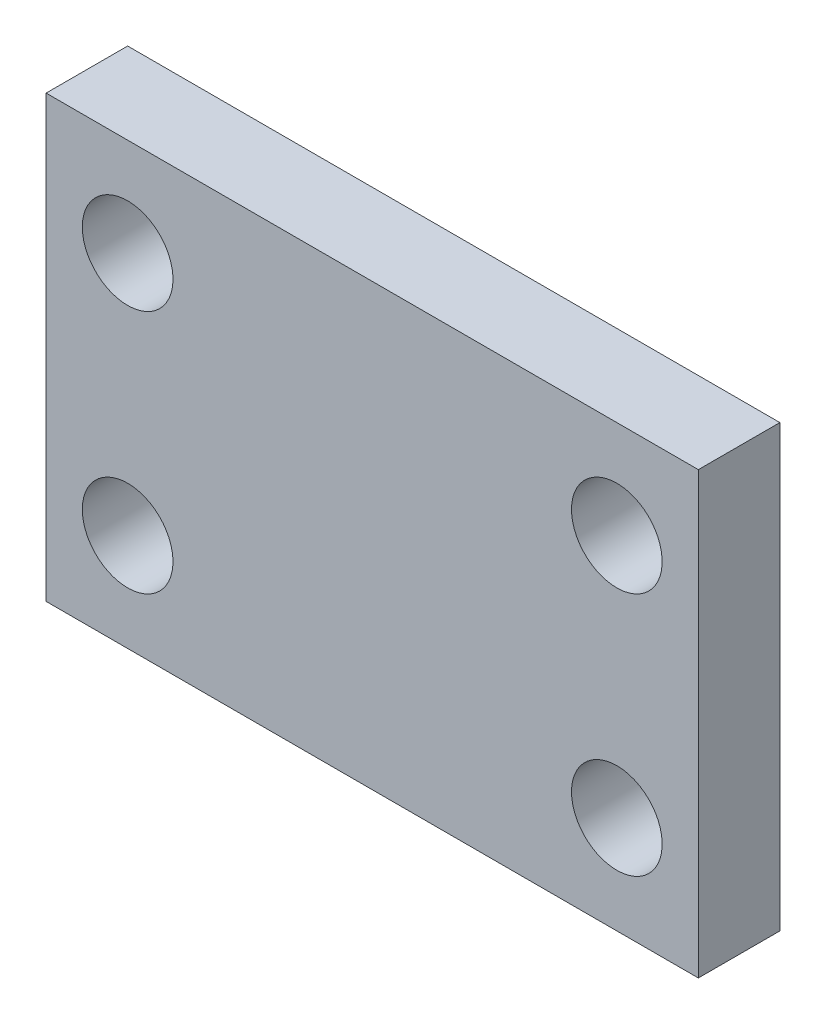
ISO-10303-21;
HEADER;
FILE_DESCRIPTION(('STEP AP214'),'2;1');
FILE_NAME('part.step','',(''),(''),'','','');
FILE_SCHEMA(('AUTOMOTIVE_DESIGN { 1 0 10303 214 1 1 1 1 }'));
ENDSEC;
DATA;
#1=APPLICATION_CONTEXT('core data for automotive mechanical design processes');
#2=APPLICATION_PROTOCOL_DEFINITION('international standard','automotive_design',2000,#1);
#3=PRODUCT_CONTEXT('',#1,'mechanical');
#4=PRODUCT('Part','Part','',(#3));
#5=PRODUCT_RELATED_PRODUCT_CATEGORY('part','',(#4));
#6=PRODUCT_DEFINITION_FORMATION('','',#4);
#7=PRODUCT_DEFINITION_CONTEXT('part definition',#1,'design');
#8=PRODUCT_DEFINITION('design','',#6,#7);
#9=PRODUCT_DEFINITION_SHAPE('','',#8);
#10=(LENGTH_UNIT() NAMED_UNIT(*) SI_UNIT(.MILLI.,.METRE.));
#11=(NAMED_UNIT(*) PLANE_ANGLE_UNIT() SI_UNIT($,.RADIAN.));
#12=(NAMED_UNIT(*) SI_UNIT($,.STERADIAN.) SOLID_ANGLE_UNIT());
#13=UNCERTAINTY_MEASURE_WITH_UNIT(LENGTH_MEASURE(1.E-05),#10,'distance_accuracy_value','');
#14=(GEOMETRIC_REPRESENTATION_CONTEXT(3) GLOBAL_UNCERTAINTY_ASSIGNED_CONTEXT((#13)) GLOBAL_UNIT_ASSIGNED_CONTEXT((#10,
#11,#12)) REPRESENTATION_CONTEXT('',''));
#15=CARTESIAN_POINT('',(0.,0.,0.));
#16=DIRECTION('',(0.,0.,1.));
#17=DIRECTION('',(1.,0.,0.));
#18=AXIS2_PLACEMENT_3D('',#15,#16,#17);
#19=CARTESIAN_POINT('',(12.7,8.5725,3.175));
#20=DIRECTION('',(-1.,0.,0.));
#21=DIRECTION('',(0.,1.,0.));
#22=AXIS2_PLACEMENT_3D('',#19,#20,#21);
#23=PLANE('',#22);
#24=DIRECTION('',(0.,-1.,0.));
#25=VECTOR('',#24,1.);
#26=CARTESIAN_POINT('',(12.7,8.5725,0.));
#27=LINE('',#26,#25);
#28=CARTESIAN_POINT('',(12.7,8.5725,0.));
#29=VERTEX_POINT('',#28);
#30=CARTESIAN_POINT('',(12.7,-8.5725,0.));
#31=VERTEX_POINT('',#30);
#32=EDGE_CURVE('E420',#29,#31,#27,.T.);
#33=ORIENTED_EDGE('',*,*,#32,.F.);
#34=DIRECTION('',(0.,0.,-1.));
#35=VECTOR('',#34,1.);
#36=CARTESIAN_POINT('',(12.7,8.5725,3.175));
#37=LINE('',#36,#35);
#38=CARTESIAN_POINT('',(12.7,8.5725,3.175));
#39=VERTEX_POINT('',#38);
#40=EDGE_CURVE('E444',#39,#29,#37,.T.);
#41=ORIENTED_EDGE('',*,*,#40,.F.);
#42=DIRECTION('',(0.,-1.,0.));
#43=VECTOR('',#42,1.);
#44=CARTESIAN_POINT('',(12.7,8.5725,3.175));
#45=LINE('',#44,#43);
#46=CARTESIAN_POINT('',(12.7,-8.5725,3.175));
#47=VERTEX_POINT('',#46);
#48=EDGE_CURVE('E425',#39,#47,#45,.T.);
#49=ORIENTED_EDGE('',*,*,#48,.T.);
#50=DIRECTION('',(0.,0.,-1.));
#51=VECTOR('',#50,1.);
#52=CARTESIAN_POINT('',(12.7,-8.5725,3.175));
#53=LINE('',#52,#51);
#54=EDGE_CURVE('E11',#47,#31,#53,.T.);
#55=ORIENTED_EDGE('',*,*,#54,.T.);
#56=EDGE_LOOP('',(#33,#41,#49,#55));
#57=FACE_BOUND('',#56,.T.);
#58=ADVANCED_FACE('F372',(#57),#23,.F.);
#59=CARTESIAN_POINT('',(12.7,-8.5725,3.175));
#60=DIRECTION('',(0.,1.,0.));
#61=DIRECTION('',(0.,0.,1.));
#62=AXIS2_PLACEMENT_3D('',#59,#60,#61);
#63=PLANE('',#62);
#64=DIRECTION('',(-1.,0.,0.));
#65=VECTOR('',#64,1.);
#66=CARTESIAN_POINT('',(12.7,-8.5725,0.));
#67=LINE('',#66,#65);
#68=CARTESIAN_POINT('',(-12.7,-8.5725,0.));
#69=VERTEX_POINT('',#68);
#70=EDGE_CURVE('E411',#31,#69,#67,.T.);
#71=ORIENTED_EDGE('',*,*,#70,.F.);
#72=ORIENTED_EDGE('',*,*,#54,.F.);
#73=DIRECTION('',(-1.,0.,0.));
#74=VECTOR('',#73,1.);
#75=CARTESIAN_POINT('',(12.7,-8.5725,3.175));
#76=LINE('',#75,#74);
#77=CARTESIAN_POINT('',(-12.7,-8.5725,3.175));
#78=VERTEX_POINT('',#77);
#79=EDGE_CURVE('E438',#47,#78,#76,.T.);
#80=ORIENTED_EDGE('',*,*,#79,.T.);
#81=DIRECTION('',(0.,0.,-1.));
#82=VECTOR('',#81,1.);
#83=CARTESIAN_POINT('',(-12.7,-8.5725,3.175));
#84=LINE('',#83,#82);
#85=EDGE_CURVE('E379',#78,#69,#84,.T.);
#86=ORIENTED_EDGE('',*,*,#85,.T.);
#87=EDGE_LOOP('',(#71,#72,#80,#86));
#88=FACE_BOUND('',#87,.T.);
#89=ADVANCED_FACE('F412',(#88),#63,.F.);
#90=CARTESIAN_POINT('',(-12.7,8.5725,3.175));
#91=DIRECTION('',(1.,0.,0.));
#92=DIRECTION('',(0.,-1.,0.));
#93=AXIS2_PLACEMENT_3D('',#90,#91,#92);
#94=PLANE('',#93);
#95=DIRECTION('',(0.,1.,0.));
#96=VECTOR('',#95,1.);
#97=CARTESIAN_POINT('',(-12.7,8.5725,0.));
#98=LINE('',#97,#96);
#99=CARTESIAN_POINT('',(-12.7,8.5725,0.));
#100=VERTEX_POINT('',#99);
#101=EDGE_CURVE('E419',#69,#100,#98,.T.);
#102=ORIENTED_EDGE('',*,*,#101,.F.);
#103=ORIENTED_EDGE('',*,*,#85,.F.);
#104=DIRECTION('',(0.,1.,0.));
#105=VECTOR('',#104,1.);
#106=CARTESIAN_POINT('',(-12.7,8.5725,3.175));
#107=LINE('',#106,#105);
#108=CARTESIAN_POINT('',(-12.7,8.5725,3.175));
#109=VERTEX_POINT('',#108);
#110=EDGE_CURVE('E440',#78,#109,#107,.T.);
#111=ORIENTED_EDGE('',*,*,#110,.T.);
#112=DIRECTION('',(0.,0.,-1.));
#113=VECTOR('',#112,1.);
#114=CARTESIAN_POINT('',(-12.7,8.5725,3.175));
#115=LINE('',#114,#113);
#116=EDGE_CURVE('E446',#109,#100,#115,.T.);
#117=ORIENTED_EDGE('',*,*,#116,.T.);
#118=EDGE_LOOP('',(#102,#103,#111,#117));
#119=FACE_BOUND('',#118,.T.);
#120=ADVANCED_FACE('F449',(#119),#94,.F.);
#121=CARTESIAN_POINT('',(12.7,8.5725,3.175));
#122=DIRECTION('',(0.,-1.,0.));
#123=DIRECTION('',(0.,0.,-1.));
#124=AXIS2_PLACEMENT_3D('',#121,#122,#123);
#125=PLANE('',#124);
#126=DIRECTION('',(1.,0.,0.));
#127=VECTOR('',#126,1.);
#128=CARTESIAN_POINT('',(12.7,8.5725,0.));
#129=LINE('',#128,#127);
#130=EDGE_CURVE('E427',#100,#29,#129,.T.);
#131=ORIENTED_EDGE('',*,*,#130,.F.);
#132=ORIENTED_EDGE('',*,*,#116,.F.);
#133=DIRECTION('',(1.,0.,0.));
#134=VECTOR('',#133,1.);
#135=CARTESIAN_POINT('',(12.7,8.5725,3.175));
#136=LINE('',#135,#134);
#137=EDGE_CURVE('E386',#109,#39,#136,.T.);
#138=ORIENTED_EDGE('',*,*,#137,.T.);
#139=ORIENTED_EDGE('',*,*,#40,.T.);
#140=EDGE_LOOP('',(#131,#132,#138,#139));
#141=FACE_BOUND('',#140,.T.);
#142=ADVANCED_FACE('F450',(#141),#125,.F.);
#143=CARTESIAN_POINT('',(12.7,-8.5725,3.175));
#144=DIRECTION('',(0.,0.,1.));
#145=DIRECTION('',(-1.,0.,0.));
#146=AXIS2_PLACEMENT_3D('',#143,#144,#145);
#147=PLANE('',#146);
#148=CARTESIAN_POINT('',(9.525,-4.7625,3.175));
#149=DIRECTION('',(0.,0.,-1.));
#150=DIRECTION('',(-1.,0.,0.));
#151=AXIS2_PLACEMENT_3D('',#148,#149,#150);
#152=CIRCLE('',#151,1.7653);
#153=CARTESIAN_POINT('',(7.7597,-4.7625,3.175));
#154=VERTEX_POINT('',#153);
#155=EDGE_CURVE('E524',#154,#154,#152,.T.);
#156=ORIENTED_EDGE('',*,*,#155,.T.);
#157=EDGE_LOOP('',(#156));
#158=FACE_BOUND('',#157,.T.);
#159=CARTESIAN_POINT('',(-9.52499999999999,-4.76250000000002,3.175));
#160=DIRECTION('',(0.,0.,-1.));
#161=DIRECTION('',(-1.,0.,0.));
#162=AXIS2_PLACEMENT_3D('',#159,#160,#161);
#163=CIRCLE('',#162,1.7653);
#164=CARTESIAN_POINT('',(-11.2903,-4.76250000000002,3.175));
#165=VERTEX_POINT('',#164);
#166=EDGE_CURVE('E526',#165,#165,#163,.T.);
#167=ORIENTED_EDGE('',*,*,#166,.T.);
#168=EDGE_LOOP('',(#167));
#169=FACE_BOUND('',#168,.T.);
#170=CARTESIAN_POINT('',(-9.525,4.7625,3.175));
#171=DIRECTION('',(0.,0.,-1.));
#172=DIRECTION('',(-1.,0.,0.));
#173=AXIS2_PLACEMENT_3D('',#170,#171,#172);
#174=CIRCLE('',#173,1.7653);
#175=CARTESIAN_POINT('',(-11.2903,4.7625,3.175));
#176=VERTEX_POINT('',#175);
#177=EDGE_CURVE('E534',#176,#176,#174,.T.);
#178=ORIENTED_EDGE('',*,*,#177,.T.);
#179=EDGE_LOOP('',(#178));
#180=FACE_BOUND('',#179,.T.);
#181=CARTESIAN_POINT('',(9.525,4.7625,3.175));
#182=DIRECTION('',(0.,0.,-1.));
#183=DIRECTION('',(-1.,0.,0.));
#184=AXIS2_PLACEMENT_3D('',#181,#182,#183);
#185=CIRCLE('',#184,1.7653);
#186=CARTESIAN_POINT('',(7.7597,4.7625,3.175));
#187=VERTEX_POINT('',#186);
#188=EDGE_CURVE('E431',#187,#187,#185,.T.);
#189=ORIENTED_EDGE('',*,*,#188,.T.);
#190=EDGE_LOOP('',(#189));
#191=FACE_BOUND('',#190,.T.);
#192=ORIENTED_EDGE('',*,*,#48,.F.);
#193=ORIENTED_EDGE('',*,*,#137,.F.);
#194=ORIENTED_EDGE('',*,*,#110,.F.);
#195=ORIENTED_EDGE('',*,*,#79,.F.);
#196=EDGE_LOOP('',(#192,#193,#194,#195));
#197=FACE_BOUND('',#196,.T.);
#198=ADVANCED_FACE('F452',(#158,#169,#180,#191,#197),#147,.T.);
#199=CARTESIAN_POINT('',(12.7,-8.5725,0.));
#200=DIRECTION('',(0.,0.,1.));
#201=DIRECTION('',(-1.,0.,0.));
#202=AXIS2_PLACEMENT_3D('',#199,#200,#201);
#203=PLANE('',#202);
#204=CARTESIAN_POINT('',(9.525,-4.7625,0.));
#205=DIRECTION('',(0.,0.,-1.));
#206=DIRECTION('',(-1.,0.,0.));
#207=AXIS2_PLACEMENT_3D('',#204,#205,#206);
#208=CIRCLE('',#207,1.7653);
#209=CARTESIAN_POINT('',(7.7597,-4.7625,0.));
#210=VERTEX_POINT('',#209);
#211=EDGE_CURVE('E521',#210,#210,#208,.T.);
#212=ORIENTED_EDGE('',*,*,#211,.F.);
#213=EDGE_LOOP('',(#212));
#214=FACE_BOUND('',#213,.T.);
#215=CARTESIAN_POINT('',(-9.52499999999999,-4.76250000000002,0.));
#216=DIRECTION('',(0.,0.,-1.));
#217=DIRECTION('',(-1.,0.,0.));
#218=AXIS2_PLACEMENT_3D('',#215,#216,#217);
#219=CIRCLE('',#218,1.7653);
#220=CARTESIAN_POINT('',(-11.2903,-4.76250000000002,0.));
#221=VERTEX_POINT('',#220);
#222=EDGE_CURVE('E531',#221,#221,#219,.T.);
#223=ORIENTED_EDGE('',*,*,#222,.F.);
#224=EDGE_LOOP('',(#223));
#225=FACE_BOUND('',#224,.T.);
#226=CARTESIAN_POINT('',(-9.525,4.7625,0.));
#227=DIRECTION('',(0.,0.,-1.));
#228=DIRECTION('',(-1.,0.,0.));
#229=AXIS2_PLACEMENT_3D('',#226,#227,#228);
#230=CIRCLE('',#229,1.7653);
#231=CARTESIAN_POINT('',(-11.2903,4.7625,0.));
#232=VERTEX_POINT('',#231);
#233=EDGE_CURVE('E537',#232,#232,#230,.T.);
#234=ORIENTED_EDGE('',*,*,#233,.F.);
#235=EDGE_LOOP('',(#234));
#236=FACE_BOUND('',#235,.T.);
#237=CARTESIAN_POINT('',(9.525,4.7625,0.));
#238=DIRECTION('',(0.,0.,-1.));
#239=DIRECTION('',(-1.,0.,0.));
#240=AXIS2_PLACEMENT_3D('',#237,#238,#239);
#241=CIRCLE('',#240,1.7653);
#242=CARTESIAN_POINT('',(7.7597,4.7625,0.));
#243=VERTEX_POINT('',#242);
#244=EDGE_CURVE('E428',#243,#243,#241,.T.);
#245=ORIENTED_EDGE('',*,*,#244,.F.);
#246=EDGE_LOOP('',(#245));
#247=FACE_BOUND('',#246,.T.);
#248=ORIENTED_EDGE('',*,*,#32,.T.);
#249=ORIENTED_EDGE('',*,*,#70,.T.);
#250=ORIENTED_EDGE('',*,*,#101,.T.);
#251=ORIENTED_EDGE('',*,*,#130,.T.);
#252=EDGE_LOOP('',(#248,#249,#250,#251));
#253=FACE_BOUND('',#252,.T.);
#254=ADVANCED_FACE('F426',(#214,#225,#236,#247,#253),#203,.F.);
#255=CARTESIAN_POINT('',(9.525,4.7625,0.));
#256=DIRECTION('',(0.,0.,1.));
#257=DIRECTION('',(-1.,0.,0.));
#258=AXIS2_PLACEMENT_3D('',#255,#256,#257);
#259=CYLINDRICAL_SURFACE('',#258,1.7653);
#260=ORIENTED_EDGE('',*,*,#244,.T.);
#261=EDGE_LOOP('',(#260));
#262=FACE_BOUND('',#261,.T.);
#263=ORIENTED_EDGE('',*,*,#188,.F.);
#264=EDGE_LOOP('',(#263));
#265=FACE_BOUND('',#264,.T.);
#266=ADVANCED_FACE('F484',(#262,#265),#259,.F.);
#267=CARTESIAN_POINT('',(-9.525,4.7625,0.));
#268=DIRECTION('',(0.,0.,1.));
#269=DIRECTION('',(-1.,0.,0.));
#270=AXIS2_PLACEMENT_3D('',#267,#268,#269);
#271=CYLINDRICAL_SURFACE('',#270,1.7653);
#272=ORIENTED_EDGE('',*,*,#233,.T.);
#273=EDGE_LOOP('',(#272));
#274=FACE_BOUND('',#273,.T.);
#275=ORIENTED_EDGE('',*,*,#177,.F.);
#276=EDGE_LOOP('',(#275));
#277=FACE_BOUND('',#276,.T.);
#278=ADVANCED_FACE('F492',(#274,#277),#271,.F.);
#279=CARTESIAN_POINT('',(-9.52499999999999,-4.76250000000002,0.));
#280=DIRECTION('',(0.,0.,1.));
#281=DIRECTION('',(-1.,0.,0.));
#282=AXIS2_PLACEMENT_3D('',#279,#280,#281);
#283=CYLINDRICAL_SURFACE('',#282,1.7653);
#284=ORIENTED_EDGE('',*,*,#222,.T.);
#285=EDGE_LOOP('',(#284));
#286=FACE_BOUND('',#285,.T.);
#287=ORIENTED_EDGE('',*,*,#166,.F.);
#288=EDGE_LOOP('',(#287));
#289=FACE_BOUND('',#288,.T.);
#290=ADVANCED_FACE('F500',(#286,#289),#283,.F.);
#291=CARTESIAN_POINT('',(9.525,-4.7625,0.));
#292=DIRECTION('',(0.,0.,1.));
#293=DIRECTION('',(-1.,0.,0.));
#294=AXIS2_PLACEMENT_3D('',#291,#292,#293);
#295=CYLINDRICAL_SURFACE('',#294,1.7653);
#296=ORIENTED_EDGE('',*,*,#211,.T.);
#297=EDGE_LOOP('',(#296));
#298=FACE_BOUND('',#297,.T.);
#299=ORIENTED_EDGE('',*,*,#155,.F.);
#300=EDGE_LOOP('',(#299));
#301=FACE_BOUND('',#300,.T.);
#302=ADVANCED_FACE('F508',(#298,#301),#295,.F.);
#303=CLOSED_SHELL('',(#58,#89,#120,#142,#198,#254,#266,#278,#290,#302));
#304=MANIFOLD_SOLID_BREP('B2',#303);
#305=ADVANCED_BREP_SHAPE_REPRESENTATION('',(#18,#304),#14);
#306=SHAPE_DEFINITION_REPRESENTATION(#9,#305);
ENDSEC;
END-ISO-10303-21;
